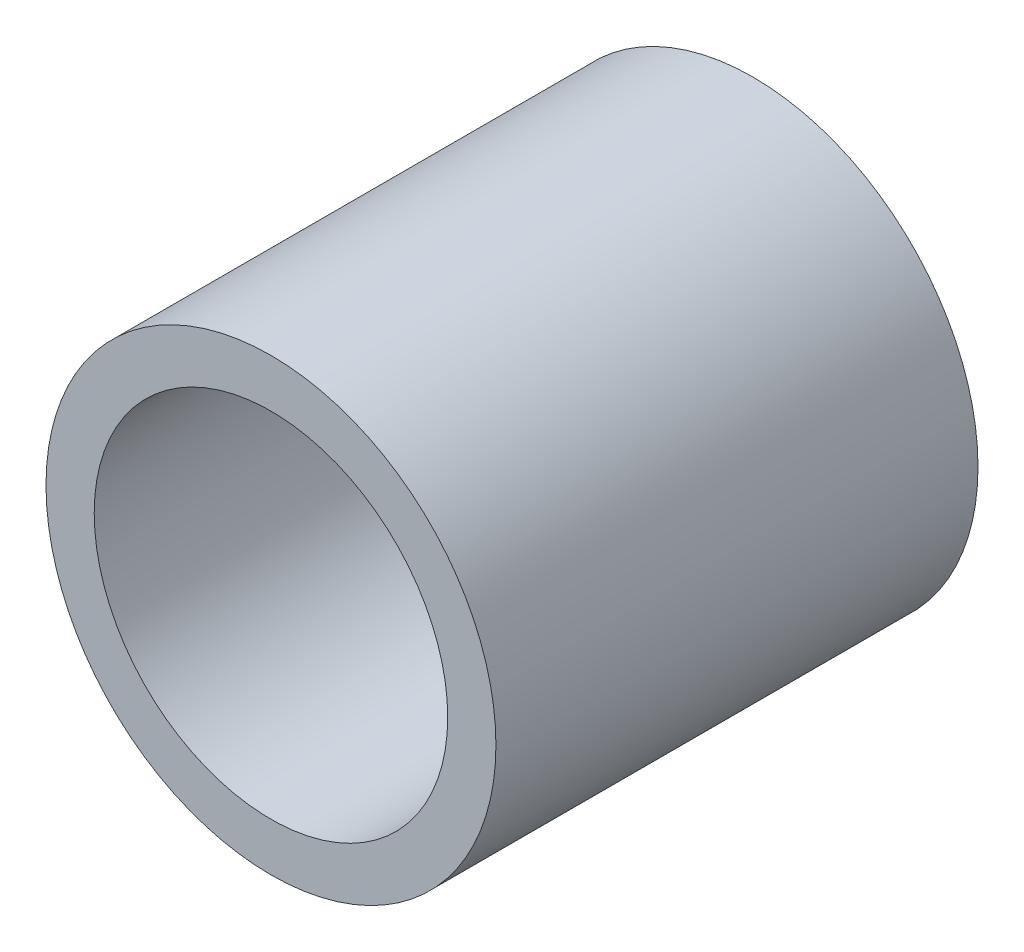
ISO-10303-21;
HEADER;
FILE_DESCRIPTION(('STEP AP214'),'2;1');
FILE_NAME('part.step','',(''),(''),'','','');
FILE_SCHEMA(('AUTOMOTIVE_DESIGN { 1 0 10303 214 1 1 1 1 }'));
ENDSEC;
DATA;
#1=APPLICATION_CONTEXT('core data for automotive mechanical design processes');
#2=APPLICATION_PROTOCOL_DEFINITION('international standard','automotive_design',2000,#1);
#3=PRODUCT_CONTEXT('',#1,'mechanical');
#4=PRODUCT('Part','Part','',(#3));
#5=PRODUCT_RELATED_PRODUCT_CATEGORY('part','',(#4));
#6=PRODUCT_DEFINITION_FORMATION('','',#4);
#7=PRODUCT_DEFINITION_CONTEXT('part definition',#1,'design');
#8=PRODUCT_DEFINITION('design','',#6,#7);
#9=PRODUCT_DEFINITION_SHAPE('','',#8);
#10=(LENGTH_UNIT() NAMED_UNIT(*) SI_UNIT(.MILLI.,.METRE.));
#11=(NAMED_UNIT(*) PLANE_ANGLE_UNIT() SI_UNIT($,.RADIAN.));
#12=(NAMED_UNIT(*) SI_UNIT($,.STERADIAN.) SOLID_ANGLE_UNIT());
#13=UNCERTAINTY_MEASURE_WITH_UNIT(LENGTH_MEASURE(1.E-05),#10,'distance_accuracy_value','');
#14=(GEOMETRIC_REPRESENTATION_CONTEXT(3) GLOBAL_UNCERTAINTY_ASSIGNED_CONTEXT((#13)) GLOBAL_UNIT_ASSIGNED_CONTEXT((#10,
#11,#12)) REPRESENTATION_CONTEXT('',''));
#15=CARTESIAN_POINT('',(0.,0.,0.));
#16=DIRECTION('',(0.,0.,1.));
#17=DIRECTION('',(1.,0.,0.));
#18=AXIS2_PLACEMENT_3D('',#15,#16,#17);
#19=CARTESIAN_POINT('',(74.869963403025,3.55494510453698,-75.));
#20=DIRECTION('',(0.,0.,1.));
#21=DIRECTION('',(1.,0.,0.));
#22=AXIS2_PLACEMENT_3D('',#19,#20,#21);
#23=CYLINDRICAL_SURFACE('',#22,27.5);
#24=CARTESIAN_POINT('',(74.869963403025,3.55494510453698,-75.));
#25=DIRECTION('',(0.,0.,1.));
#26=DIRECTION('',(1.,0.,0.));
#27=AXIS2_PLACEMENT_3D('',#24,#25,#26);
#28=CIRCLE('',#27,27.5);
#29=CARTESIAN_POINT('',(102.369963403025,3.55494510453698,-75.));
#30=VERTEX_POINT('',#29);
#31=EDGE_CURVE('E47',#30,#30,#28,.T.);
#32=ORIENTED_EDGE('',*,*,#31,.F.);
#33=EDGE_LOOP('',(#32));
#34=FACE_BOUND('',#33,.T.);
#35=CARTESIAN_POINT('',(74.869963403025,3.55494510453698,0.));
#36=DIRECTION('',(0.,0.,1.));
#37=DIRECTION('',(1.,0.,0.));
#38=AXIS2_PLACEMENT_3D('',#35,#36,#37);
#39=CIRCLE('',#38,27.5);
#40=CARTESIAN_POINT('',(102.369963403025,3.55494510453698,0.));
#41=VERTEX_POINT('',#40);
#42=EDGE_CURVE('E54',#41,#41,#39,.T.);
#43=ORIENTED_EDGE('',*,*,#42,.T.);
#44=EDGE_LOOP('',(#43));
#45=FACE_BOUND('',#44,.T.);
#46=ADVANCED_FACE('F39',(#34,#45),#23,.F.);
#47=CARTESIAN_POINT('',(74.869963403025,3.55494510453698,-75.));
#48=DIRECTION('',(0.,0.,1.));
#49=DIRECTION('',(1.,0.,0.));
#50=AXIS2_PLACEMENT_3D('',#47,#48,#49);
#51=CYLINDRICAL_SURFACE('',#50,35.);
#52=CARTESIAN_POINT('',(74.869963403025,3.55494510453698,-75.));
#53=DIRECTION('',(0.,0.,1.));
#54=DIRECTION('',(1.,0.,0.));
#55=AXIS2_PLACEMENT_3D('',#52,#53,#54);
#56=CIRCLE('',#55,35.);
#57=CARTESIAN_POINT('',(109.869963403025,3.55494510453698,-75.));
#58=VERTEX_POINT('',#57);
#59=EDGE_CURVE('E10',#58,#58,#56,.T.);
#60=ORIENTED_EDGE('',*,*,#59,.T.);
#61=EDGE_LOOP('',(#60));
#62=FACE_BOUND('',#61,.T.);
#63=CARTESIAN_POINT('',(74.869963403025,3.55494510453698,0.));
#64=DIRECTION('',(0.,0.,1.));
#65=DIRECTION('',(1.,0.,0.));
#66=AXIS2_PLACEMENT_3D('',#63,#64,#65);
#67=CIRCLE('',#66,35.);
#68=CARTESIAN_POINT('',(109.869963403025,3.55494510453698,0.));
#69=VERTEX_POINT('',#68);
#70=EDGE_CURVE('E42',#69,#69,#67,.T.);
#71=ORIENTED_EDGE('',*,*,#70,.F.);
#72=EDGE_LOOP('',(#71));
#73=FACE_BOUND('',#72,.T.);
#74=ADVANCED_FACE('F65',(#62,#73),#51,.T.);
#75=CARTESIAN_POINT('',(0.,0.,-75.));
#76=DIRECTION('',(0.,0.,1.));
#77=DIRECTION('',(1.,0.,0.));
#78=AXIS2_PLACEMENT_3D('',#75,#76,#77);
#79=PLANE('',#78);
#80=ORIENTED_EDGE('',*,*,#31,.T.);
#81=EDGE_LOOP('',(#80));
#82=FACE_BOUND('',#81,.T.);
#83=ORIENTED_EDGE('',*,*,#59,.F.);
#84=EDGE_LOOP('',(#83));
#85=FACE_BOUND('',#84,.T.);
#86=ADVANCED_FACE('F67',(#82,#85),#79,.F.);
#87=CARTESIAN_POINT('',(0.,0.,0.));
#88=DIRECTION('',(0.,0.,1.));
#89=DIRECTION('',(1.,0.,0.));
#90=AXIS2_PLACEMENT_3D('',#87,#88,#89);
#91=PLANE('',#90);
#92=ORIENTED_EDGE('',*,*,#42,.F.);
#93=EDGE_LOOP('',(#92));
#94=FACE_BOUND('',#93,.T.);
#95=ORIENTED_EDGE('',*,*,#70,.T.);
#96=EDGE_LOOP('',(#95));
#97=FACE_BOUND('',#96,.T.);
#98=ADVANCED_FACE('F63',(#94,#97),#91,.T.);
#99=CLOSED_SHELL('',(#46,#74,#86,#98));
#100=MANIFOLD_SOLID_BREP('B2',#99);
#101=ADVANCED_BREP_SHAPE_REPRESENTATION('',(#18,#100),#14);
#102=SHAPE_DEFINITION_REPRESENTATION(#9,#101);
ENDSEC;
END-ISO-10303-21;
